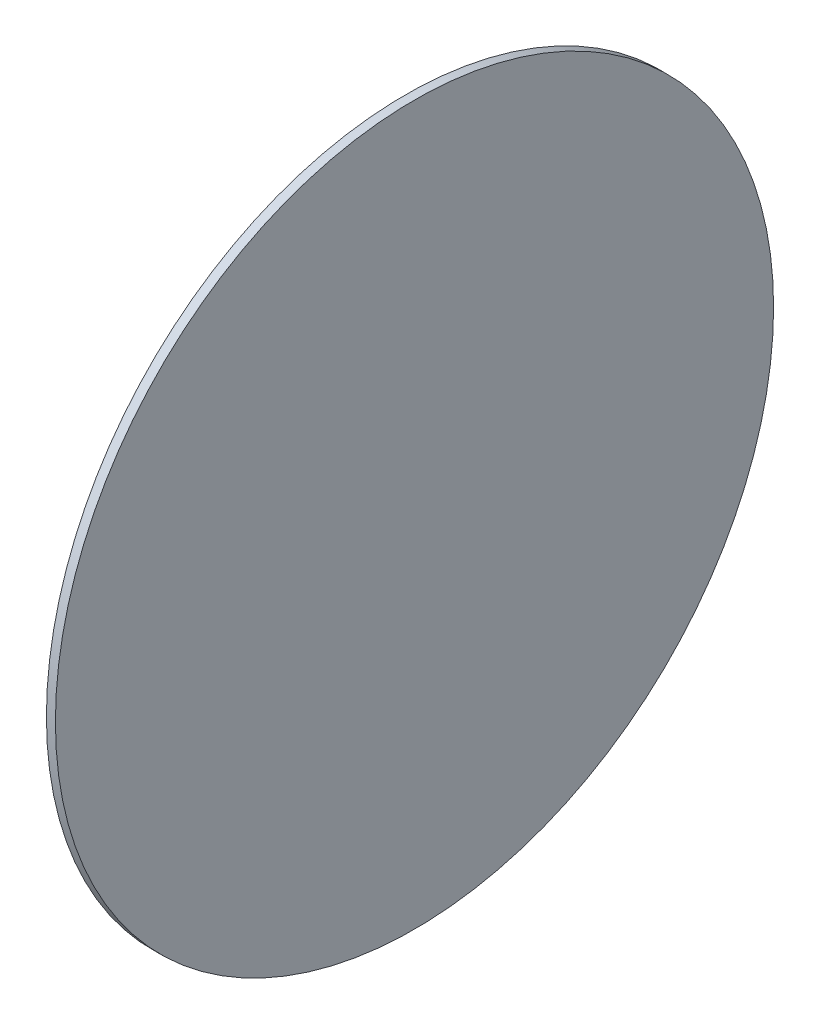
ISO-10303-21;
HEADER;
FILE_DESCRIPTION(('STEP AP214'),'2;1');
FILE_NAME('part.step','',(''),(''),'','','');
FILE_SCHEMA(('AUTOMOTIVE_DESIGN { 1 0 10303 214 1 1 1 1 }'));
ENDSEC;
DATA;
#1=APPLICATION_CONTEXT('core data for automotive mechanical design processes');
#2=APPLICATION_PROTOCOL_DEFINITION('international standard','automotive_design',2000,#1);
#3=PRODUCT_CONTEXT('',#1,'mechanical');
#4=PRODUCT('Part','Part','',(#3));
#5=PRODUCT_RELATED_PRODUCT_CATEGORY('part','',(#4));
#6=PRODUCT_DEFINITION_FORMATION('','',#4);
#7=PRODUCT_DEFINITION_CONTEXT('part definition',#1,'design');
#8=PRODUCT_DEFINITION('design','',#6,#7);
#9=PRODUCT_DEFINITION_SHAPE('','',#8);
#10=(LENGTH_UNIT() NAMED_UNIT(*) SI_UNIT(.MILLI.,.METRE.));
#11=(NAMED_UNIT(*) PLANE_ANGLE_UNIT() SI_UNIT($,.RADIAN.));
#12=(NAMED_UNIT(*) SI_UNIT($,.STERADIAN.) SOLID_ANGLE_UNIT());
#13=UNCERTAINTY_MEASURE_WITH_UNIT(LENGTH_MEASURE(1.E-05),#10,'distance_accuracy_value','');
#14=(GEOMETRIC_REPRESENTATION_CONTEXT(3) GLOBAL_UNCERTAINTY_ASSIGNED_CONTEXT((#13)) GLOBAL_UNIT_ASSIGNED_CONTEXT((#10,
#11,#12)) REPRESENTATION_CONTEXT('',''));
#15=CARTESIAN_POINT('',(0.,0.,0.));
#16=DIRECTION('',(0.,0.,1.));
#17=DIRECTION('',(1.,0.,0.));
#18=AXIS2_PLACEMENT_3D('',#15,#16,#17);
#19=CARTESIAN_POINT('',(2.5,0.,0.));
#20=DIRECTION('',(-1.,0.,0.));
#21=DIRECTION('',(0.,0.,1.));
#22=AXIS2_PLACEMENT_3D('',#19,#20,#21);
#23=CYLINDRICAL_SURFACE('',#22,99.83);
#24=CARTESIAN_POINT('',(2.5,0.,0.));
#25=DIRECTION('',(1.,0.,0.));
#26=DIRECTION('',(0.,0.,-1.));
#27=AXIS2_PLACEMENT_3D('',#24,#25,#26);
#28=CIRCLE('',#27,99.83);
#29=CARTESIAN_POINT('',(2.5,0.,-99.83));
#30=VERTEX_POINT('',#29);
#31=EDGE_CURVE('E10',#30,#30,#28,.T.);
#32=ORIENTED_EDGE('',*,*,#31,.F.);
#33=EDGE_LOOP('',(#32));
#34=FACE_BOUND('',#33,.T.);
#35=CARTESIAN_POINT('',(0.,0.,0.));
#36=DIRECTION('',(1.,0.,0.));
#37=DIRECTION('',(0.,0.,-1.));
#38=AXIS2_PLACEMENT_3D('',#35,#36,#37);
#39=CIRCLE('',#38,99.83);
#40=CARTESIAN_POINT('',(0.,0.,-99.83));
#41=VERTEX_POINT('',#40);
#42=EDGE_CURVE('E40',#41,#41,#39,.T.);
#43=ORIENTED_EDGE('',*,*,#42,.T.);
#44=EDGE_LOOP('',(#43));
#45=FACE_BOUND('',#44,.T.);
#46=ADVANCED_FACE('F37',(#34,#45),#23,.T.);
#47=CARTESIAN_POINT('',(2.5,0.,0.));
#48=DIRECTION('',(1.,0.,0.));
#49=DIRECTION('',(0.,0.,-1.));
#50=AXIS2_PLACEMENT_3D('',#47,#48,#49);
#51=PLANE('',#50);
#52=ORIENTED_EDGE('',*,*,#31,.T.);
#53=EDGE_LOOP('',(#52));
#54=FACE_BOUND('',#53,.T.);
#55=ADVANCED_FACE('F52',(#54),#51,.T.);
#56=CARTESIAN_POINT('',(0.,0.,0.));
#57=DIRECTION('',(1.,0.,0.));
#58=DIRECTION('',(0.,0.,-1.));
#59=AXIS2_PLACEMENT_3D('',#56,#57,#58);
#60=PLANE('',#59);
#61=ORIENTED_EDGE('',*,*,#42,.F.);
#62=EDGE_LOOP('',(#61));
#63=FACE_BOUND('',#62,.T.);
#64=ADVANCED_FACE('F50',(#63),#60,.F.);
#65=CLOSED_SHELL('',(#46,#55,#64));
#66=MANIFOLD_SOLID_BREP('B2',#65);
#67=ADVANCED_BREP_SHAPE_REPRESENTATION('',(#18,#66),#14);
#68=SHAPE_DEFINITION_REPRESENTATION(#9,#67);
ENDSEC;
END-ISO-10303-21;
